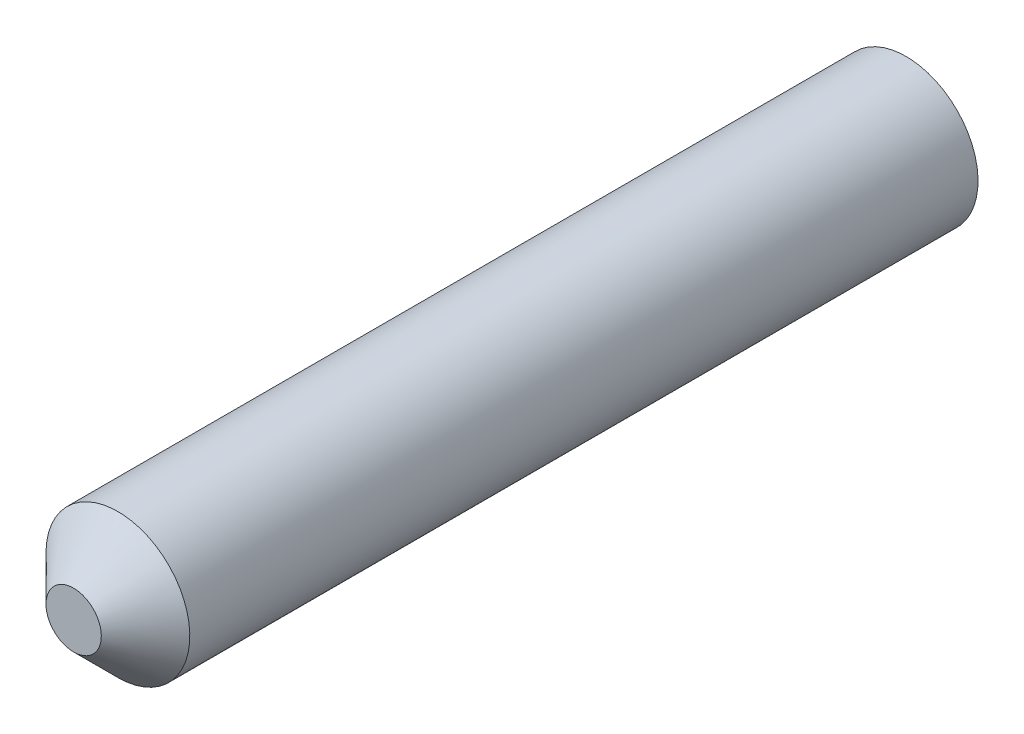
ISO-10303-21;
HEADER;
FILE_DESCRIPTION(('STEP AP214'),'2;1');
FILE_NAME('part.step','',(''),(''),'','','');
FILE_SCHEMA(('AUTOMOTIVE_DESIGN { 1 0 10303 214 1 1 1 1 }'));
ENDSEC;
DATA;
#1=APPLICATION_CONTEXT('core data for automotive mechanical design processes');
#2=APPLICATION_PROTOCOL_DEFINITION('international standard','automotive_design',2000,#1);
#3=PRODUCT_CONTEXT('',#1,'mechanical');
#4=PRODUCT('Part','Part','',(#3));
#5=PRODUCT_RELATED_PRODUCT_CATEGORY('part','',(#4));
#6=PRODUCT_DEFINITION_FORMATION('','',#4);
#7=PRODUCT_DEFINITION_CONTEXT('part definition',#1,'design');
#8=PRODUCT_DEFINITION('design','',#6,#7);
#9=PRODUCT_DEFINITION_SHAPE('','',#8);
#10=(LENGTH_UNIT() NAMED_UNIT(*) SI_UNIT(.MILLI.,.METRE.));
#11=(NAMED_UNIT(*) PLANE_ANGLE_UNIT() SI_UNIT($,.RADIAN.));
#12=(NAMED_UNIT(*) SI_UNIT($,.STERADIAN.) SOLID_ANGLE_UNIT());
#13=UNCERTAINTY_MEASURE_WITH_UNIT(LENGTH_MEASURE(1.E-05),#10,'distance_accuracy_value','');
#14=(GEOMETRIC_REPRESENTATION_CONTEXT(3) GLOBAL_UNCERTAINTY_ASSIGNED_CONTEXT((#13)) GLOBAL_UNIT_ASSIGNED_CONTEXT((#10,
#11,#12)) REPRESENTATION_CONTEXT('',''));
#15=CARTESIAN_POINT('',(0.,0.,0.));
#16=DIRECTION('',(0.,0.,1.));
#17=DIRECTION('',(1.,0.,0.));
#18=AXIS2_PLACEMENT_3D('',#15,#16,#17);
#19=CARTESIAN_POINT('',(-12.,0.,-12.675));
#20=DIRECTION('',(0.,0.,-1.));
#21=DIRECTION('',(0.,1.,0.));
#22=AXIS2_PLACEMENT_3D('',#19,#20,#21);
#23=CONICAL_SURFACE('',#22,0.45,0.7853981634);
#24=CARTESIAN_POINT('',(-12.,0.,-12.475));
#25=DIRECTION('',(0.,0.,-1.));
#26=DIRECTION('',(0.,1.,0.));
#27=AXIS2_PLACEMENT_3D('',#24,#25,#26);
#28=CIRCLE('',#27,0.25);
#29=CARTESIAN_POINT('',(-12.,-0.25,-12.475));
#30=VERTEX_POINT('',#29);
#31=EDGE_CURVE('E11',#30,#30,#28,.T.);
#32=ORIENTED_EDGE('',*,*,#31,.T.);
#33=CARTESIAN_POINT('',(-12.,-0.249999999999489,-12.475000000001));
#34=CARTESIAN_POINT('',(-12.,-0.65000000000051,-12.874999999999));
#35=B_SPLINE_CURVE_WITH_KNOTS('',1,(#33,#34),.UNSPECIFIED.,.F.,.F.,(2,2),(-0.28284271247462,
0.282842712474619),.UNSPECIFIED.);
#36=CARTESIAN_POINT('',(-12.,-0.65,-12.875));
#37=VERTEX_POINT('',#36);
#38=EDGE_CURVE('E24',#30,#37,#35,.T.);
#39=ORIENTED_EDGE('',*,*,#38,.T.);
#40=CARTESIAN_POINT('',(-12.,0.,-12.875));
#41=DIRECTION('',(0.,0.,1.));
#42=DIRECTION('',(0.,1.,0.));
#43=AXIS2_PLACEMENT_3D('',#40,#41,#42);
#44=CIRCLE('',#43,0.65);
#45=EDGE_CURVE('E41',#37,#37,#44,.T.);
#46=ORIENTED_EDGE('',*,*,#45,.T.);
#47=ORIENTED_EDGE('',*,*,#38,.F.);
#48=EDGE_LOOP('',(#32,#39,#46,#47));
#49=FACE_BOUND('',#48,.T.);
#50=ADVANCED_FACE('F17',(#49),#23,.T.);
#51=CARTESIAN_POINT('',(-12.,0.,-12.475));
#52=DIRECTION('',(0.,0.,-1.));
#53=DIRECTION('',(0.,1.,0.));
#54=AXIS2_PLACEMENT_3D('',#51,#52,#53);
#55=CYLINDRICAL_SURFACE('',#54,0.65);
#56=CARTESIAN_POINT('',(-12.,0.,-20.));
#57=DIRECTION('',(0.,0.,-1.));
#58=DIRECTION('',(0.,1.,0.));
#59=AXIS2_PLACEMENT_3D('',#56,#57,#58);
#60=CIRCLE('',#59,0.65);
#61=CARTESIAN_POINT('',(-12.,-0.65,-20.));
#62=VERTEX_POINT('',#61);
#63=EDGE_CURVE('E36',#62,#62,#60,.T.);
#64=ORIENTED_EDGE('',*,*,#63,.F.);
#65=CARTESIAN_POINT('',(-12.,-0.65,-12.875));
#66=CARTESIAN_POINT('',(-12.,-0.65,-20.));
#67=B_SPLINE_CURVE_WITH_KNOTS('',1,(#65,#66),.UNSPECIFIED.,.F.,.F.,(2,2),(0.4,7.525),.UNSPECIFIED.);
#68=EDGE_CURVE('E42',#37,#62,#67,.T.);
#69=ORIENTED_EDGE('',*,*,#68,.F.);
#70=ORIENTED_EDGE('',*,*,#45,.F.);
#71=ORIENTED_EDGE('',*,*,#68,.T.);
#72=EDGE_LOOP('',(#64,#69,#70,#71));
#73=FACE_BOUND('',#72,.T.);
#74=ADVANCED_FACE('F57',(#73),#55,.T.);
#75=CARTESIAN_POINT('',(-12.,0.,-12.475));
#76=DIRECTION('',(0.,0.,-1.));
#77=DIRECTION('',(0.,1.,0.));
#78=AXIS2_PLACEMENT_3D('',#75,#76,#77);
#79=PLANE('',#78);
#80=ORIENTED_EDGE('',*,*,#31,.F.);
#81=EDGE_LOOP('',(#80));
#82=FACE_BOUND('',#81,.T.);
#83=ADVANCED_FACE('F63',(#82),#79,.F.);
#84=CARTESIAN_POINT('',(-1.04461879526,-0.712240098159247,-20.));
#85=DIRECTION('',(0.,0.,1.));
#86=DIRECTION('',(1.,0.,0.));
#87=AXIS2_PLACEMENT_3D('',#84,#85,#86);
#88=PLANE('',#87);
#89=ORIENTED_EDGE('',*,*,#63,.T.);
#90=EDGE_LOOP('',(#89));
#91=FACE_BOUND('',#90,.T.);
#92=ADVANCED_FACE('F37',(#91),#88,.F.);
#93=CLOSED_SHELL('',(#50,#74,#83,#92));
#94=MANIFOLD_SOLID_BREP('B1',#93);
#95=ADVANCED_BREP_SHAPE_REPRESENTATION('',(#18,#94),#14);
#96=SHAPE_DEFINITION_REPRESENTATION(#9,#95);
ENDSEC;
END-ISO-10303-21;
